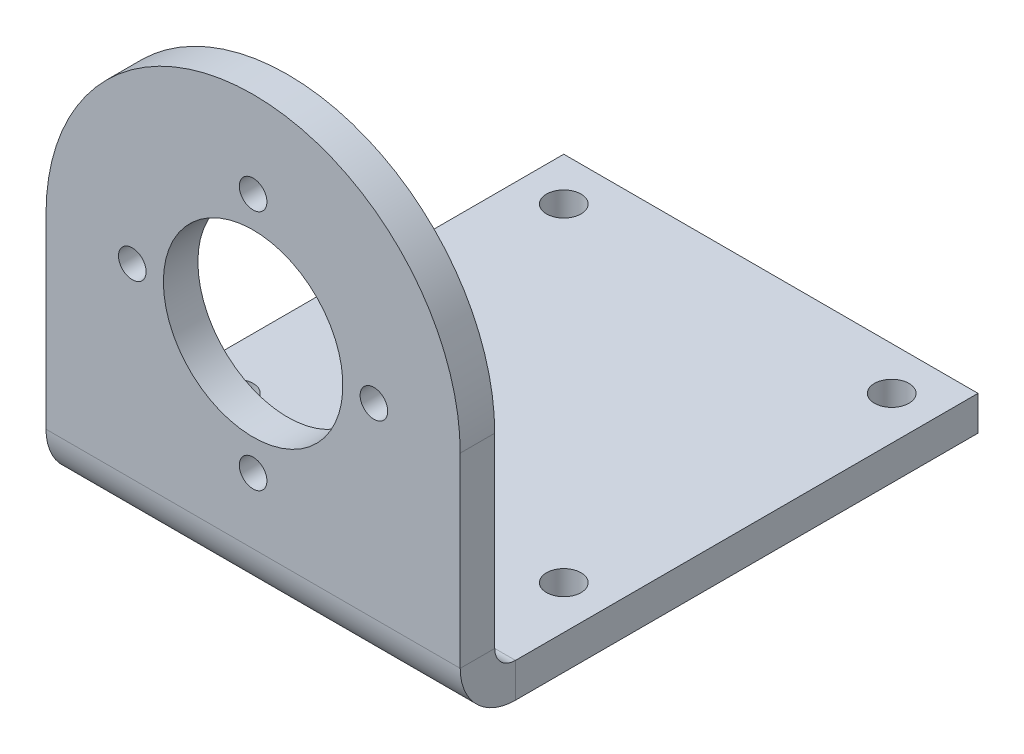
ISO-10303-21;
HEADER;
FILE_DESCRIPTION(('STEP AP214'),'2;1');
FILE_NAME('part.step','',(''),(''),'','','');
FILE_SCHEMA(('AUTOMOTIVE_DESIGN { 1 0 10303 214 1 1 1 1 }'));
ENDSEC;
DATA;
#1=APPLICATION_CONTEXT('core data for automotive mechanical design processes');
#2=APPLICATION_PROTOCOL_DEFINITION('international standard','automotive_design',2000,#1);
#3=PRODUCT_CONTEXT('',#1,'mechanical');
#4=PRODUCT('Part','Part','',(#3));
#5=PRODUCT_RELATED_PRODUCT_CATEGORY('part','',(#4));
#6=PRODUCT_DEFINITION_FORMATION('','',#4);
#7=PRODUCT_DEFINITION_CONTEXT('part definition',#1,'design');
#8=PRODUCT_DEFINITION('design','',#6,#7);
#9=PRODUCT_DEFINITION_SHAPE('','',#8);
#10=(LENGTH_UNIT() NAMED_UNIT(*) SI_UNIT(.MILLI.,.METRE.));
#11=(NAMED_UNIT(*) PLANE_ANGLE_UNIT() SI_UNIT($,.RADIAN.));
#12=(NAMED_UNIT(*) SI_UNIT($,.STERADIAN.) SOLID_ANGLE_UNIT());
#13=UNCERTAINTY_MEASURE_WITH_UNIT(LENGTH_MEASURE(1.E-05),#10,'distance_accuracy_value','');
#14=(GEOMETRIC_REPRESENTATION_CONTEXT(3) GLOBAL_UNCERTAINTY_ASSIGNED_CONTEXT((#13)) GLOBAL_UNIT_ASSIGNED_CONTEXT((#10,
#11,#12)) REPRESENTATION_CONTEXT('',''));
#15=CARTESIAN_POINT('',(0.,0.,0.));
#16=DIRECTION('',(0.,0.,1.));
#17=DIRECTION('',(1.,0.,0.));
#18=AXIS2_PLACEMENT_3D('',#15,#16,#17);
#19=CARTESIAN_POINT('',(-30.,-30.,-5.));
#20=DIRECTION('',(-1.,0.,0.));
#21=DIRECTION('',(0.,0.,1.));
#22=AXIS2_PLACEMENT_3D('',#19,#20,#21);
#23=PLANE('',#22);
#24=DIRECTION('',(0.,-1.,0.));
#25=VECTOR('',#24,1.);
#26=CARTESIAN_POINT('',(-30.,-30.,0.));
#27=LINE('',#26,#25);
#28=CARTESIAN_POINT('',(-30.,0.,0.));
#29=VERTEX_POINT('',#28);
#30=CARTESIAN_POINT('',(-30.,-27.,0.));
#31=VERTEX_POINT('',#30);
#32=EDGE_CURVE('E64',#29,#31,#27,.T.);
#33=ORIENTED_EDGE('',*,*,#32,.F.);
#34=DIRECTION('',(0.,0.,1.));
#35=VECTOR('',#34,1.);
#36=CARTESIAN_POINT('',(-30.,0.,-47.4264068711929));
#37=LINE('',#36,#35);
#38=CARTESIAN_POINT('',(-30.,0.,-5.));
#39=VERTEX_POINT('',#38);
#40=EDGE_CURVE('E134',#39,#29,#37,.T.);
#41=ORIENTED_EDGE('',*,*,#40,.F.);
#42=DIRECTION('',(0.,-1.,0.));
#43=VECTOR('',#42,1.);
#44=CARTESIAN_POINT('',(-30.,-30.,-5.));
#45=LINE('',#44,#43);
#46=CARTESIAN_POINT('',(-30.,-27.,-5.));
#47=VERTEX_POINT('',#46);
#48=EDGE_CURVE('E12',#39,#47,#45,.T.);
#49=ORIENTED_EDGE('',*,*,#48,.T.);
#50=DIRECTION('',(0.,0.,1.));
#51=VECTOR('',#50,1.);
#52=CARTESIAN_POINT('',(-30.,-27.,-5.));
#53=LINE('',#52,#51);
#54=EDGE_CURVE('E146',#47,#31,#53,.T.);
#55=ORIENTED_EDGE('',*,*,#54,.T.);
#56=EDGE_LOOP('',(#33,#41,#49,#55));
#57=FACE_BOUND('',#56,.T.);
#58=ADVANCED_FACE('F60',(#57),#23,.T.);
#59=CARTESIAN_POINT('',(0.,0.,-5.));
#60=DIRECTION('',(0.,0.,-1.));
#61=DIRECTION('',(-1.,0.,0.));
#62=AXIS2_PLACEMENT_3D('',#59,#60,#61);
#63=PLANE('',#62);
#64=CARTESIAN_POINT('',(0.,0.,-5.));
#65=DIRECTION('',(0.,0.,-1.));
#66=DIRECTION('',(-1.,0.,0.));
#67=AXIS2_PLACEMENT_3D('',#64,#65,#66);
#68=CIRCLE('',#67,30.);
#69=CARTESIAN_POINT('',(30.,0.,-5.));
#70=VERTEX_POINT('',#69);
#71=EDGE_CURVE('E127',#39,#70,#68,.T.);
#72=ORIENTED_EDGE('',*,*,#71,.T.);
#73=DIRECTION('',(0.,1.,0.));
#74=VECTOR('',#73,1.);
#75=CARTESIAN_POINT('',(30.,-30.,-5.));
#76=LINE('',#75,#74);
#77=CARTESIAN_POINT('',(30.,-27.,-5.));
#78=VERTEX_POINT('',#77);
#79=EDGE_CURVE('E69',#78,#70,#76,.T.);
#80=ORIENTED_EDGE('',*,*,#79,.F.);
#81=DIRECTION('',(-1.,0.,0.));
#82=VECTOR('',#81,1.);
#83=CARTESIAN_POINT('',(-30.,-27.,-5.));
#84=LINE('',#83,#82);
#85=EDGE_CURVE('E158',#47,#78,#84,.F.);
#86=ORIENTED_EDGE('',*,*,#85,.F.);
#87=ORIENTED_EDGE('',*,*,#48,.F.);
#88=EDGE_LOOP('',(#72,#80,#86,#87));
#89=FACE_BOUND('',#88,.T.);
#90=CARTESIAN_POINT('',(17.5,0.,-5.));
#91=DIRECTION('',(0.,0.,-1.));
#92=DIRECTION('',(-1.,0.,0.));
#93=AXIS2_PLACEMENT_3D('',#90,#91,#92);
#94=CIRCLE('',#93,2.);
#95=CARTESIAN_POINT('',(15.5,0.,-5.));
#96=VERTEX_POINT('',#95);
#97=EDGE_CURVE('E210',#96,#96,#94,.T.);
#98=ORIENTED_EDGE('',*,*,#97,.F.);
#99=EDGE_LOOP('',(#98));
#100=FACE_BOUND('',#99,.T.);
#101=CARTESIAN_POINT('',(0.,17.5,-5.));
#102=DIRECTION('',(0.,0.,-1.));
#103=DIRECTION('',(-1.,0.,0.));
#104=AXIS2_PLACEMENT_3D('',#101,#102,#103);
#105=CIRCLE('',#104,2.);
#106=CARTESIAN_POINT('',(-2.,17.5,-5.));
#107=VERTEX_POINT('',#106);
#108=EDGE_CURVE('E202',#107,#107,#105,.T.);
#109=ORIENTED_EDGE('',*,*,#108,.F.);
#110=EDGE_LOOP('',(#109));
#111=FACE_BOUND('',#110,.T.);
#112=CARTESIAN_POINT('',(0.,-17.5,-5.));
#113=DIRECTION('',(0.,0.,-1.));
#114=DIRECTION('',(-1.,0.,0.));
#115=AXIS2_PLACEMENT_3D('',#112,#113,#114);
#116=CIRCLE('',#115,2.);
#117=CARTESIAN_POINT('',(-2.,-17.5,-5.));
#118=VERTEX_POINT('',#117);
#119=EDGE_CURVE('E209',#118,#118,#116,.T.);
#120=ORIENTED_EDGE('',*,*,#119,.F.);
#121=EDGE_LOOP('',(#120));
#122=FACE_BOUND('',#121,.T.);
#123=CARTESIAN_POINT('',(0.,0.,-5.));
#124=DIRECTION('',(0.,0.,-1.));
#125=DIRECTION('',(-1.,0.,0.));
#126=AXIS2_PLACEMENT_3D('',#123,#124,#125);
#127=CIRCLE('',#126,13.);
#128=CARTESIAN_POINT('',(-13.,0.,-5.));
#129=VERTEX_POINT('',#128);
#130=EDGE_CURVE('E216',#129,#129,#127,.T.);
#131=ORIENTED_EDGE('',*,*,#130,.F.);
#132=EDGE_LOOP('',(#131));
#133=FACE_BOUND('',#132,.T.);
#134=CARTESIAN_POINT('',(-17.5,0.,-5.));
#135=DIRECTION('',(0.,0.,-1.));
#136=DIRECTION('',(-1.,0.,0.));
#137=AXIS2_PLACEMENT_3D('',#134,#135,#136);
#138=CIRCLE('',#137,2.);
#139=CARTESIAN_POINT('',(-19.5,0.,-5.));
#140=VERTEX_POINT('',#139);
#141=EDGE_CURVE('E198',#140,#140,#138,.T.);
#142=ORIENTED_EDGE('',*,*,#141,.F.);
#143=EDGE_LOOP('',(#142));
#144=FACE_BOUND('',#143,.T.);
#145=ADVANCED_FACE('F129',(#89,#100,#111,#122,#133,#144),#63,.T.);
#146=CARTESIAN_POINT('',(0.,0.,0.));
#147=DIRECTION('',(0.,0.,-1.));
#148=DIRECTION('',(-1.,0.,0.));
#149=AXIS2_PLACEMENT_3D('',#146,#147,#148);
#150=PLANE('',#149);
#151=CARTESIAN_POINT('',(-17.5,0.,0.));
#152=DIRECTION('',(0.,0.,-1.));
#153=DIRECTION('',(-1.,0.,0.));
#154=AXIS2_PLACEMENT_3D('',#151,#152,#153);
#155=CIRCLE('',#154,2.);
#156=CARTESIAN_POINT('',(-19.5,0.,0.));
#157=VERTEX_POINT('',#156);
#158=EDGE_CURVE('E213',#157,#157,#155,.T.);
#159=ORIENTED_EDGE('',*,*,#158,.T.);
#160=EDGE_LOOP('',(#159));
#161=FACE_BOUND('',#160,.T.);
#162=CARTESIAN_POINT('',(0.,0.,0.));
#163=DIRECTION('',(0.,0.,-1.));
#164=DIRECTION('',(-1.,0.,0.));
#165=AXIS2_PLACEMENT_3D('',#162,#163,#164);
#166=CIRCLE('',#165,13.);
#167=CARTESIAN_POINT('',(-13.,0.,0.));
#168=VERTEX_POINT('',#167);
#169=EDGE_CURVE('E220',#168,#168,#166,.T.);
#170=ORIENTED_EDGE('',*,*,#169,.T.);
#171=EDGE_LOOP('',(#170));
#172=FACE_BOUND('',#171,.T.);
#173=CARTESIAN_POINT('',(0.,-17.5,0.));
#174=DIRECTION('',(0.,0.,-1.));
#175=DIRECTION('',(-1.,0.,0.));
#176=AXIS2_PLACEMENT_3D('',#173,#174,#175);
#177=CIRCLE('',#176,2.);
#178=CARTESIAN_POINT('',(-2.,-17.5,0.));
#179=VERTEX_POINT('',#178);
#180=EDGE_CURVE('E219',#179,#179,#177,.T.);
#181=ORIENTED_EDGE('',*,*,#180,.T.);
#182=EDGE_LOOP('',(#181));
#183=FACE_BOUND('',#182,.T.);
#184=CARTESIAN_POINT('',(0.,17.5,0.));
#185=DIRECTION('',(0.,0.,-1.));
#186=DIRECTION('',(-1.,0.,0.));
#187=AXIS2_PLACEMENT_3D('',#184,#185,#186);
#188=CIRCLE('',#187,2.);
#189=CARTESIAN_POINT('',(-2.,17.5,0.));
#190=VERTEX_POINT('',#189);
#191=EDGE_CURVE('E206',#190,#190,#188,.T.);
#192=ORIENTED_EDGE('',*,*,#191,.T.);
#193=EDGE_LOOP('',(#192));
#194=FACE_BOUND('',#193,.T.);
#195=CARTESIAN_POINT('',(17.5,0.,0.));
#196=DIRECTION('',(0.,0.,-1.));
#197=DIRECTION('',(-1.,0.,0.));
#198=AXIS2_PLACEMENT_3D('',#195,#196,#197);
#199=CIRCLE('',#198,2.);
#200=CARTESIAN_POINT('',(15.5,0.,0.));
#201=VERTEX_POINT('',#200);
#202=EDGE_CURVE('E205',#201,#201,#199,.T.);
#203=ORIENTED_EDGE('',*,*,#202,.T.);
#204=EDGE_LOOP('',(#203));
#205=FACE_BOUND('',#204,.T.);
#206=DIRECTION('',(0.,1.,0.));
#207=VECTOR('',#206,1.);
#208=CARTESIAN_POINT('',(30.,-30.,0.));
#209=LINE('',#208,#207);
#210=CARTESIAN_POINT('',(30.,-27.,0.));
#211=VERTEX_POINT('',#210);
#212=CARTESIAN_POINT('',(30.,0.,0.));
#213=VERTEX_POINT('',#212);
#214=EDGE_CURVE('E144',#211,#213,#209,.T.);
#215=ORIENTED_EDGE('',*,*,#214,.T.);
#216=CARTESIAN_POINT('',(0.,0.,0.));
#217=DIRECTION('',(0.,0.,-1.));
#218=DIRECTION('',(-1.,0.,0.));
#219=AXIS2_PLACEMENT_3D('',#216,#217,#218);
#220=CIRCLE('',#219,30.);
#221=EDGE_CURVE('E140',#29,#213,#220,.T.);
#222=ORIENTED_EDGE('',*,*,#221,.F.);
#223=ORIENTED_EDGE('',*,*,#32,.T.);
#224=DIRECTION('',(-1.,0.,0.));
#225=VECTOR('',#224,1.);
#226=CARTESIAN_POINT('',(-30.,-27.,0.));
#227=LINE('',#226,#225);
#228=EDGE_CURVE('E167',#31,#211,#227,.F.);
#229=ORIENTED_EDGE('',*,*,#228,.T.);
#230=EDGE_LOOP('',(#215,#222,#223,#229));
#231=FACE_BOUND('',#230,.T.);
#232=ADVANCED_FACE('F256',(#161,#172,#183,#194,#205,#231),#150,.F.);
#233=CARTESIAN_POINT('',(30.,-30.,-5.));
#234=DIRECTION('',(1.,0.,0.));
#235=DIRECTION('',(0.,0.,-1.));
#236=AXIS2_PLACEMENT_3D('',#233,#234,#235);
#237=PLANE('',#236);
#238=DIRECTION('',(0.,0.,1.));
#239=VECTOR('',#238,1.);
#240=CARTESIAN_POINT('',(30.,0.,-47.4264068711929));
#241=LINE('',#240,#239);
#242=EDGE_CURVE('E137',#70,#213,#241,.T.);
#243=ORIENTED_EDGE('',*,*,#242,.T.);
#244=ORIENTED_EDGE('',*,*,#214,.F.);
#245=DIRECTION('',(0.,0.,1.));
#246=VECTOR('',#245,1.);
#247=CARTESIAN_POINT('',(30.,-27.,-5.));
#248=LINE('',#247,#246);
#249=EDGE_CURVE('E83',#78,#211,#248,.T.);
#250=ORIENTED_EDGE('',*,*,#249,.F.);
#251=ORIENTED_EDGE('',*,*,#79,.T.);
#252=EDGE_LOOP('',(#243,#244,#250,#251));
#253=FACE_BOUND('',#252,.T.);
#254=ADVANCED_FACE('F62',(#253),#237,.T.);
#255=CARTESIAN_POINT('',(30.,-27.,-8.));
#256=DIRECTION('',(1.,0.,0.));
#257=DIRECTION('',(0.,0.,-1.));
#258=AXIS2_PLACEMENT_3D('',#255,#256,#257);
#259=PLANE('',#258);
#260=DIRECTION('',(0.,-1.,0.));
#261=VECTOR('',#260,1.);
#262=CARTESIAN_POINT('',(30.,-30.,-7.99999999999999));
#263=LINE('',#262,#261);
#264=CARTESIAN_POINT('',(30.,-30.,-7.99999999999999));
#265=VERTEX_POINT('',#264);
#266=CARTESIAN_POINT('',(30.,-35.,-7.99999999999997));
#267=VERTEX_POINT('',#266);
#268=EDGE_CURVE('E194',#265,#267,#263,.T.);
#269=ORIENTED_EDGE('',*,*,#268,.F.);
#270=CARTESIAN_POINT('',(30.,-27.,-8.));
#271=DIRECTION('',(-1.,0.,0.));
#272=DIRECTION('',(0.,0.,1.));
#273=AXIS2_PLACEMENT_3D('',#270,#271,#272);
#274=CIRCLE('',#273,3.);
#275=EDGE_CURVE('E161',#78,#265,#274,.F.);
#276=ORIENTED_EDGE('',*,*,#275,.F.);
#277=ORIENTED_EDGE('',*,*,#249,.T.);
#278=CARTESIAN_POINT('',(30.,-27.,-8.));
#279=DIRECTION('',(-1.,0.,0.));
#280=DIRECTION('',(0.,0.,1.));
#281=AXIS2_PLACEMENT_3D('',#278,#279,#280);
#282=CIRCLE('',#281,8.);
#283=EDGE_CURVE('E153',#211,#267,#282,.F.);
#284=ORIENTED_EDGE('',*,*,#283,.T.);
#285=EDGE_LOOP('',(#269,#276,#277,#284));
#286=FACE_BOUND('',#285,.T.);
#287=ADVANCED_FACE('F280',(#286),#259,.T.);
#288=CARTESIAN_POINT('',(-30.,-27.,-8.));
#289=DIRECTION('',(1.,0.,0.));
#290=DIRECTION('',(0.,0.,-1.));
#291=AXIS2_PLACEMENT_3D('',#288,#289,#290);
#292=PLANE('',#291);
#293=CARTESIAN_POINT('',(-30.,-27.,-8.));
#294=DIRECTION('',(-1.,0.,0.));
#295=DIRECTION('',(0.,0.,1.));
#296=AXIS2_PLACEMENT_3D('',#293,#294,#295);
#297=CIRCLE('',#296,3.);
#298=CARTESIAN_POINT('',(-30.,-30.,-7.99999999999999));
#299=VERTEX_POINT('',#298);
#300=EDGE_CURVE('E155',#299,#47,#297,.T.);
#301=ORIENTED_EDGE('',*,*,#300,.F.);
#302=DIRECTION('',(0.,-1.,0.));
#303=VECTOR('',#302,1.);
#304=CARTESIAN_POINT('',(-30.,-30.,-7.99999999999999));
#305=LINE('',#304,#303);
#306=CARTESIAN_POINT('',(-30.,-35.,-7.99999999999997));
#307=VERTEX_POINT('',#306);
#308=EDGE_CURVE('E193',#299,#307,#305,.T.);
#309=ORIENTED_EDGE('',*,*,#308,.T.);
#310=CARTESIAN_POINT('',(-30.,-27.,-8.));
#311=DIRECTION('',(-1.,0.,0.));
#312=DIRECTION('',(0.,0.,1.));
#313=AXIS2_PLACEMENT_3D('',#310,#311,#312);
#314=CIRCLE('',#313,8.);
#315=EDGE_CURVE('E164',#307,#31,#314,.T.);
#316=ORIENTED_EDGE('',*,*,#315,.T.);
#317=ORIENTED_EDGE('',*,*,#54,.F.);
#318=EDGE_LOOP('',(#301,#309,#316,#317));
#319=FACE_BOUND('',#318,.T.);
#320=ADVANCED_FACE('F263',(#319),#292,.F.);
#321=CARTESIAN_POINT('',(-30.,-27.,-8.));
#322=DIRECTION('',(-1.,0.,0.));
#323=DIRECTION('',(0.,-1.,0.));
#324=AXIS2_PLACEMENT_3D('',#321,#322,#323);
#325=CYLINDRICAL_SURFACE('',#324,8.);
#326=ORIENTED_EDGE('',*,*,#228,.F.);
#327=ORIENTED_EDGE('',*,*,#315,.F.);
#328=DIRECTION('',(-1.,0.,0.));
#329=VECTOR('',#328,1.);
#330=CARTESIAN_POINT('',(0.,-35.,-7.99999999999997));
#331=LINE('',#330,#329);
#332=EDGE_CURVE('E184',#267,#307,#331,.T.);
#333=ORIENTED_EDGE('',*,*,#332,.F.);
#334=ORIENTED_EDGE('',*,*,#283,.F.);
#335=EDGE_LOOP('',(#326,#327,#333,#334));
#336=FACE_BOUND('',#335,.T.);
#337=ADVANCED_FACE('F262',(#336),#325,.T.);
#338=CARTESIAN_POINT('',(-30.,-27.,-8.));
#339=DIRECTION('',(-1.,0.,0.));
#340=DIRECTION('',(0.,-1.,0.));
#341=AXIS2_PLACEMENT_3D('',#338,#339,#340);
#342=CYLINDRICAL_SURFACE('',#341,3.);
#343=ORIENTED_EDGE('',*,*,#85,.T.);
#344=ORIENTED_EDGE('',*,*,#275,.T.);
#345=DIRECTION('',(-1.,0.,0.));
#346=VECTOR('',#345,1.);
#347=CARTESIAN_POINT('',(30.,-30.,-7.99999999999999));
#348=LINE('',#347,#346);
#349=EDGE_CURVE('E197',#265,#299,#348,.T.);
#350=ORIENTED_EDGE('',*,*,#349,.T.);
#351=ORIENTED_EDGE('',*,*,#300,.T.);
#352=EDGE_LOOP('',(#343,#344,#350,#351));
#353=FACE_BOUND('',#352,.T.);
#354=ADVANCED_FACE('F283',(#353),#342,.F.);
#355=CARTESIAN_POINT('',(-30.,-35.,-4.99999999999998));
#356=DIRECTION('',(-1.,0.,0.));
#357=DIRECTION('',(0.,0.,1.));
#358=AXIS2_PLACEMENT_3D('',#355,#356,#357);
#359=PLANE('',#358);
#360=DIRECTION('',(0.,0.,1.));
#361=VECTOR('',#360,1.);
#362=CARTESIAN_POINT('',(-30.,-35.,-4.99999999999998));
#363=LINE('',#362,#361);
#364=CARTESIAN_POINT('',(-30.,-35.0000000000002,-75.));
#365=VERTEX_POINT('',#364);
#366=EDGE_CURVE('E173',#365,#307,#363,.T.);
#367=ORIENTED_EDGE('',*,*,#366,.T.);
#368=ORIENTED_EDGE('',*,*,#308,.F.);
#369=DIRECTION('',(0.,0.,1.));
#370=VECTOR('',#369,1.);
#371=CARTESIAN_POINT('',(-30.,-30.,-5.));
#372=LINE('',#371,#370);
#373=CARTESIAN_POINT('',(-30.,-30.0000000000002,-75.));
#374=VERTEX_POINT('',#373);
#375=EDGE_CURVE('E175',#374,#299,#372,.T.);
#376=ORIENTED_EDGE('',*,*,#375,.F.);
#377=DIRECTION('',(0.,1.,0.));
#378=VECTOR('',#377,1.);
#379=CARTESIAN_POINT('',(-30.,-35.0000000000002,-75.));
#380=LINE('',#379,#378);
#381=EDGE_CURVE('E159',#365,#374,#380,.T.);
#382=ORIENTED_EDGE('',*,*,#381,.F.);
#383=EDGE_LOOP('',(#367,#368,#376,#382));
#384=FACE_BOUND('',#383,.T.);
#385=ADVANCED_FACE('F272',(#384),#359,.T.);
#386=CARTESIAN_POINT('',(30.,-35.0000000000002,-75.));
#387=DIRECTION('',(1.,0.,0.));
#388=DIRECTION('',(0.,0.,-1.));
#389=AXIS2_PLACEMENT_3D('',#386,#387,#388);
#390=PLANE('',#389);
#391=DIRECTION('',(0.,0.,-1.));
#392=VECTOR('',#391,1.);
#393=CARTESIAN_POINT('',(30.,-30.0000000000002,-75.));
#394=LINE('',#393,#392);
#395=CARTESIAN_POINT('',(30.,-30.0000000000002,-75.));
#396=VERTEX_POINT('',#395);
#397=EDGE_CURVE('E182',#265,#396,#394,.T.);
#398=ORIENTED_EDGE('',*,*,#397,.F.);
#399=ORIENTED_EDGE('',*,*,#268,.T.);
#400=DIRECTION('',(0.,0.,-1.));
#401=VECTOR('',#400,1.);
#402=CARTESIAN_POINT('',(30.,-35.0000000000002,-75.));
#403=LINE('',#402,#401);
#404=CARTESIAN_POINT('',(30.,-35.0000000000002,-75.));
#405=VERTEX_POINT('',#404);
#406=EDGE_CURVE('E178',#267,#405,#403,.T.);
#407=ORIENTED_EDGE('',*,*,#406,.T.);
#408=DIRECTION('',(0.,1.,0.));
#409=VECTOR('',#408,1.);
#410=CARTESIAN_POINT('',(30.,-35.0000000000002,-75.));
#411=LINE('',#410,#409);
#412=EDGE_CURVE('E170',#405,#396,#411,.T.);
#413=ORIENTED_EDGE('',*,*,#412,.T.);
#414=EDGE_LOOP('',(#398,#399,#407,#413));
#415=FACE_BOUND('',#414,.T.);
#416=ADVANCED_FACE('F279',(#415),#390,.T.);
#417=CARTESIAN_POINT('',(0.,-35.,1.21540815252824E-13));
#418=DIRECTION('',(0.,-1.,0.));
#419=DIRECTION('',(0.,0.,-1.));
#420=AXIS2_PLACEMENT_3D('',#417,#418,#419);
#421=PLANE('',#420);
#422=CARTESIAN_POINT('',(23.75,-35.0000000000001,-21.25));
#423=DIRECTION('',(0.,-1.,0.));
#424=DIRECTION('',(0.,0.,-1.));
#425=AXIS2_PLACEMENT_3D('',#422,#423,#424);
#426=CIRCLE('',#425,2.5);
#427=CARTESIAN_POINT('',(23.75,-35.0000000000001,-23.75));
#428=VERTEX_POINT('',#427);
#429=EDGE_CURVE('E238',#428,#428,#426,.T.);
#430=ORIENTED_EDGE('',*,*,#429,.F.);
#431=EDGE_LOOP('',(#430));
#432=FACE_BOUND('',#431,.T.);
#433=CARTESIAN_POINT('',(23.75,-35.0000000000002,-68.75));
#434=DIRECTION('',(0.,-1.,0.));
#435=DIRECTION('',(0.,0.,-1.));
#436=AXIS2_PLACEMENT_3D('',#433,#434,#435);
#437=CIRCLE('',#436,2.5);
#438=CARTESIAN_POINT('',(23.75,-35.0000000000002,-71.25));
#439=VERTEX_POINT('',#438);
#440=EDGE_CURVE('E244',#439,#439,#437,.T.);
#441=ORIENTED_EDGE('',*,*,#440,.F.);
#442=EDGE_LOOP('',(#441));
#443=FACE_BOUND('',#442,.T.);
#444=CARTESIAN_POINT('',(-23.75,-35.0000000000002,-68.75));
#445=DIRECTION('',(0.,-1.,0.));
#446=DIRECTION('',(0.,0.,-1.));
#447=AXIS2_PLACEMENT_3D('',#444,#445,#446);
#448=CIRCLE('',#447,2.5);
#449=CARTESIAN_POINT('',(-23.75,-35.0000000000002,-71.25));
#450=VERTEX_POINT('',#449);
#451=EDGE_CURVE('E237',#450,#450,#448,.T.);
#452=ORIENTED_EDGE('',*,*,#451,.F.);
#453=EDGE_LOOP('',(#452));
#454=FACE_BOUND('',#453,.T.);
#455=CARTESIAN_POINT('',(-23.75,-35.0000000000001,-21.25));
#456=DIRECTION('',(0.,-1.,0.));
#457=DIRECTION('',(0.,0.,-1.));
#458=AXIS2_PLACEMENT_3D('',#455,#456,#457);
#459=CIRCLE('',#458,2.5);
#460=CARTESIAN_POINT('',(-23.75,-35.0000000000001,-23.75));
#461=VERTEX_POINT('',#460);
#462=EDGE_CURVE('E223',#461,#461,#459,.T.);
#463=ORIENTED_EDGE('',*,*,#462,.F.);
#464=EDGE_LOOP('',(#463));
#465=FACE_BOUND('',#464,.T.);
#466=ORIENTED_EDGE('',*,*,#406,.F.);
#467=ORIENTED_EDGE('',*,*,#332,.T.);
#468=ORIENTED_EDGE('',*,*,#366,.F.);
#469=DIRECTION('',(-1.,0.,0.));
#470=VECTOR('',#469,1.);
#471=CARTESIAN_POINT('',(-30.,-35.0000000000002,-75.));
#472=LINE('',#471,#470);
#473=EDGE_CURVE('E187',#405,#365,#472,.T.);
#474=ORIENTED_EDGE('',*,*,#473,.F.);
#475=EDGE_LOOP('',(#466,#467,#468,#474));
#476=FACE_BOUND('',#475,.T.);
#477=ADVANCED_FACE('F270',(#432,#443,#454,#465,#476),#421,.T.);
#478=CARTESIAN_POINT('',(0.,-30.,1.04083408558608E-13));
#479=DIRECTION('',(0.,-1.,0.));
#480=DIRECTION('',(0.,0.,-1.));
#481=AXIS2_PLACEMENT_3D('',#478,#479,#480);
#482=PLANE('',#481);
#483=CARTESIAN_POINT('',(23.75,-30.0000000000001,-21.25));
#484=DIRECTION('',(0.,-1.,0.));
#485=DIRECTION('',(0.,0.,-1.));
#486=AXIS2_PLACEMENT_3D('',#483,#484,#485);
#487=CIRCLE('',#486,2.5);
#488=CARTESIAN_POINT('',(23.75,-30.0000000000001,-23.75));
#489=VERTEX_POINT('',#488);
#490=EDGE_CURVE('E133',#489,#489,#487,.T.);
#491=ORIENTED_EDGE('',*,*,#490,.T.);
#492=EDGE_LOOP('',(#491));
#493=FACE_BOUND('',#492,.T.);
#494=CARTESIAN_POINT('',(23.75,-30.0000000000002,-68.75));
#495=DIRECTION('',(0.,-1.,0.));
#496=DIRECTION('',(0.,0.,-1.));
#497=AXIS2_PLACEMENT_3D('',#494,#495,#496);
#498=CIRCLE('',#497,2.5);
#499=CARTESIAN_POINT('',(23.75,-30.0000000000002,-71.25));
#500=VERTEX_POINT('',#499);
#501=EDGE_CURVE('E241',#500,#500,#498,.T.);
#502=ORIENTED_EDGE('',*,*,#501,.T.);
#503=EDGE_LOOP('',(#502));
#504=FACE_BOUND('',#503,.T.);
#505=CARTESIAN_POINT('',(-23.75,-30.0000000000002,-68.75));
#506=DIRECTION('',(0.,-1.,0.));
#507=DIRECTION('',(0.,0.,-1.));
#508=AXIS2_PLACEMENT_3D('',#505,#506,#507);
#509=CIRCLE('',#508,2.5);
#510=CARTESIAN_POINT('',(-23.75,-30.0000000000002,-71.25));
#511=VERTEX_POINT('',#510);
#512=EDGE_CURVE('E247',#511,#511,#509,.T.);
#513=ORIENTED_EDGE('',*,*,#512,.T.);
#514=EDGE_LOOP('',(#513));
#515=FACE_BOUND('',#514,.T.);
#516=CARTESIAN_POINT('',(-23.75,-30.0000000000001,-21.25));
#517=DIRECTION('',(0.,-1.,0.));
#518=DIRECTION('',(0.,0.,-1.));
#519=AXIS2_PLACEMENT_3D('',#516,#517,#518);
#520=CIRCLE('',#519,2.5);
#521=CARTESIAN_POINT('',(-23.75,-30.0000000000001,-23.75));
#522=VERTEX_POINT('',#521);
#523=EDGE_CURVE('E234',#522,#522,#520,.T.);
#524=ORIENTED_EDGE('',*,*,#523,.T.);
#525=EDGE_LOOP('',(#524));
#526=FACE_BOUND('',#525,.T.);
#527=ORIENTED_EDGE('',*,*,#349,.F.);
#528=ORIENTED_EDGE('',*,*,#397,.T.);
#529=DIRECTION('',(-1.,0.,0.));
#530=VECTOR('',#529,1.);
#531=CARTESIAN_POINT('',(-30.,-30.0000000000002,-75.));
#532=LINE('',#531,#530);
#533=EDGE_CURVE('E179',#396,#374,#532,.T.);
#534=ORIENTED_EDGE('',*,*,#533,.T.);
#535=ORIENTED_EDGE('',*,*,#375,.T.);
#536=EDGE_LOOP('',(#527,#528,#534,#535));
#537=FACE_BOUND('',#536,.T.);
#538=ADVANCED_FACE('F285',(#493,#504,#515,#526,#537),#482,.F.);
#539=CARTESIAN_POINT('',(-30.,-35.0000000000002,-75.));
#540=DIRECTION('',(0.,0.,-1.));
#541=DIRECTION('',(0.,1.,0.));
#542=AXIS2_PLACEMENT_3D('',#539,#540,#541);
#543=PLANE('',#542);
#544=ORIENTED_EDGE('',*,*,#533,.F.);
#545=ORIENTED_EDGE('',*,*,#412,.F.);
#546=ORIENTED_EDGE('',*,*,#473,.T.);
#547=ORIENTED_EDGE('',*,*,#381,.T.);
#548=EDGE_LOOP('',(#544,#545,#546,#547));
#549=FACE_BOUND('',#548,.T.);
#550=ADVANCED_FACE('F276',(#549),#543,.T.);
#551=CARTESIAN_POINT('',(17.5,0.,-41.7695526217005));
#552=DIRECTION('',(0.,0.,1.));
#553=DIRECTION('',(1.,0.,0.));
#554=AXIS2_PLACEMENT_3D('',#551,#552,#553);
#555=CYLINDRICAL_SURFACE('',#554,2.);
#556=ORIENTED_EDGE('',*,*,#202,.F.);
#557=EDGE_LOOP('',(#556));
#558=FACE_BOUND('',#557,.T.);
#559=ORIENTED_EDGE('',*,*,#97,.T.);
#560=EDGE_LOOP('',(#559));
#561=FACE_BOUND('',#560,.T.);
#562=ADVANCED_FACE('F293',(#558,#561),#555,.F.);
#563=CARTESIAN_POINT('',(0.,17.5,-41.7695526217005));
#564=DIRECTION('',(0.,0.,1.));
#565=DIRECTION('',(1.,0.,0.));
#566=AXIS2_PLACEMENT_3D('',#563,#564,#565);
#567=CYLINDRICAL_SURFACE('',#566,2.);
#568=ORIENTED_EDGE('',*,*,#191,.F.);
#569=EDGE_LOOP('',(#568));
#570=FACE_BOUND('',#569,.T.);
#571=ORIENTED_EDGE('',*,*,#108,.T.);
#572=EDGE_LOOP('',(#571));
#573=FACE_BOUND('',#572,.T.);
#574=ADVANCED_FACE('F461',(#570,#573),#567,.F.);
#575=CARTESIAN_POINT('',(0.,-17.5,-41.7695526217005));
#576=DIRECTION('',(0.,0.,1.));
#577=DIRECTION('',(1.,0.,0.));
#578=AXIS2_PLACEMENT_3D('',#575,#576,#577);
#579=CYLINDRICAL_SURFACE('',#578,2.);
#580=ORIENTED_EDGE('',*,*,#180,.F.);
#581=EDGE_LOOP('',(#580));
#582=FACE_BOUND('',#581,.T.);
#583=ORIENTED_EDGE('',*,*,#119,.T.);
#584=EDGE_LOOP('',(#583));
#585=FACE_BOUND('',#584,.T.);
#586=ADVANCED_FACE('F452',(#582,#585),#579,.F.);
#587=CARTESIAN_POINT('',(0.,0.,-41.7695526217005));
#588=DIRECTION('',(0.,0.,1.));
#589=DIRECTION('',(1.,0.,0.));
#590=AXIS2_PLACEMENT_3D('',#587,#588,#589);
#591=CYLINDRICAL_SURFACE('',#590,13.);
#592=ORIENTED_EDGE('',*,*,#169,.F.);
#593=EDGE_LOOP('',(#592));
#594=FACE_BOUND('',#593,.T.);
#595=ORIENTED_EDGE('',*,*,#130,.T.);
#596=EDGE_LOOP('',(#595));
#597=FACE_BOUND('',#596,.T.);
#598=ADVANCED_FACE('F443',(#594,#597),#591,.F.);
#599=CARTESIAN_POINT('',(-17.5,0.,-41.7695526217005));
#600=DIRECTION('',(0.,0.,1.));
#601=DIRECTION('',(1.,0.,0.));
#602=AXIS2_PLACEMENT_3D('',#599,#600,#601);
#603=CYLINDRICAL_SURFACE('',#602,2.);
#604=ORIENTED_EDGE('',*,*,#158,.F.);
#605=EDGE_LOOP('',(#604));
#606=FACE_BOUND('',#605,.T.);
#607=ORIENTED_EDGE('',*,*,#141,.T.);
#608=EDGE_LOOP('',(#607));
#609=FACE_BOUND('',#608,.T.);
#610=ADVANCED_FACE('F338',(#606,#609),#603,.F.);
#611=CARTESIAN_POINT('',(-23.75,-42.0710678118655,-21.25));
#612=DIRECTION('',(0.,1.,0.));
#613=DIRECTION('',(0.,0.,1.));
#614=AXIS2_PLACEMENT_3D('',#611,#612,#613);
#615=CYLINDRICAL_SURFACE('',#614,2.5);
#616=ORIENTED_EDGE('',*,*,#523,.F.);
#617=EDGE_LOOP('',(#616));
#618=FACE_BOUND('',#617,.T.);
#619=ORIENTED_EDGE('',*,*,#462,.T.);
#620=EDGE_LOOP('',(#619));
#621=FACE_BOUND('',#620,.T.);
#622=ADVANCED_FACE('F349',(#618,#621),#615,.F.);
#623=CARTESIAN_POINT('',(-23.75,-42.0710678118657,-68.75));
#624=DIRECTION('',(0.,1.,0.));
#625=DIRECTION('',(0.,0.,1.));
#626=AXIS2_PLACEMENT_3D('',#623,#624,#625);
#627=CYLINDRICAL_SURFACE('',#626,2.5);
#628=ORIENTED_EDGE('',*,*,#512,.F.);
#629=EDGE_LOOP('',(#628));
#630=FACE_BOUND('',#629,.T.);
#631=ORIENTED_EDGE('',*,*,#451,.T.);
#632=EDGE_LOOP('',(#631));
#633=FACE_BOUND('',#632,.T.);
#634=ADVANCED_FACE('F354',(#630,#633),#627,.F.);
#635=CARTESIAN_POINT('',(23.75,-42.0710678118657,-68.75));
#636=DIRECTION('',(0.,1.,0.));
#637=DIRECTION('',(0.,0.,1.));
#638=AXIS2_PLACEMENT_3D('',#635,#636,#637);
#639=CYLINDRICAL_SURFACE('',#638,2.5);
#640=ORIENTED_EDGE('',*,*,#501,.F.);
#641=EDGE_LOOP('',(#640));
#642=FACE_BOUND('',#641,.T.);
#643=ORIENTED_EDGE('',*,*,#440,.T.);
#644=EDGE_LOOP('',(#643));
#645=FACE_BOUND('',#644,.T.);
#646=ADVANCED_FACE('F365',(#642,#645),#639,.F.);
#647=CARTESIAN_POINT('',(23.75,-42.0710678118655,-21.25));
#648=DIRECTION('',(0.,1.,0.));
#649=DIRECTION('',(0.,0.,1.));
#650=AXIS2_PLACEMENT_3D('',#647,#648,#649);
#651=CYLINDRICAL_SURFACE('',#650,2.5);
#652=ORIENTED_EDGE('',*,*,#490,.F.);
#653=EDGE_LOOP('',(#652));
#654=FACE_BOUND('',#653,.T.);
#655=ORIENTED_EDGE('',*,*,#429,.T.);
#656=EDGE_LOOP('',(#655));
#657=FACE_BOUND('',#656,.T.);
#658=ADVANCED_FACE('F376',(#654,#657),#651,.F.);
#659=CARTESIAN_POINT('',(0.,0.,-47.4264068711929));
#660=DIRECTION('',(0.,0.,1.));
#661=DIRECTION('',(1.,0.,0.));
#662=AXIS2_PLACEMENT_3D('',#659,#660,#661);
#663=CYLINDRICAL_SURFACE('',#662,30.);
#664=ORIENTED_EDGE('',*,*,#40,.T.);
#665=ORIENTED_EDGE('',*,*,#221,.T.);
#666=ORIENTED_EDGE('',*,*,#242,.F.);
#667=ORIENTED_EDGE('',*,*,#71,.F.);
#668=EDGE_LOOP('',(#664,#665,#666,#667));
#669=FACE_BOUND('',#668,.T.);
#670=ADVANCED_FACE('F138',(#669),#663,.T.);
#671=CLOSED_SHELL('',(#58,#145,#232,#254,#287,#320,#337,#354,#385,#416,#477,#538,#550,#562,#574,
#586,#598,#610,#622,#634,#646,#658,#670));
#672=MANIFOLD_SOLID_BREP('B2',#671);
#673=ADVANCED_BREP_SHAPE_REPRESENTATION('',(#18,#672),#14);
#674=SHAPE_DEFINITION_REPRESENTATION(#9,#673);
ENDSEC;
END-ISO-10303-21;
